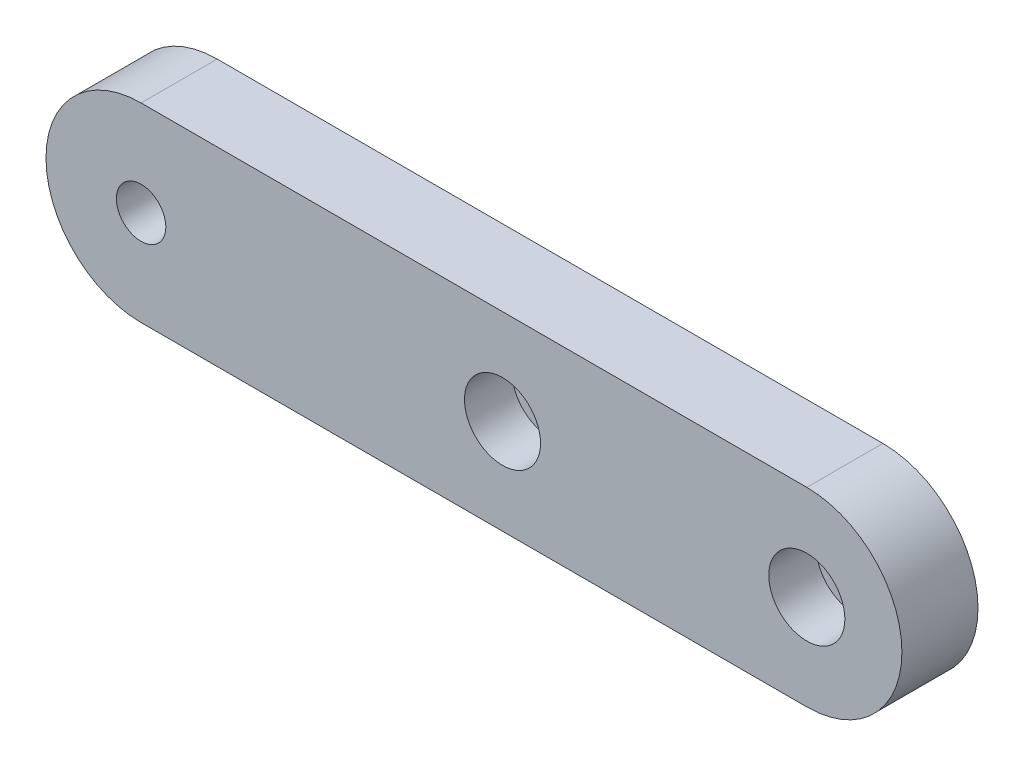
ISO-10303-21;
HEADER;
FILE_DESCRIPTION(('STEP AP214'),'2;1');
FILE_NAME('part.step','',(''),(''),'','','');
FILE_SCHEMA(('AUTOMOTIVE_DESIGN { 1 0 10303 214 1 1 1 1 }'));
ENDSEC;
DATA;
#1=APPLICATION_CONTEXT('core data for automotive mechanical design processes');
#2=APPLICATION_PROTOCOL_DEFINITION('international standard','automotive_design',2000,#1);
#3=PRODUCT_CONTEXT('',#1,'mechanical');
#4=PRODUCT('Part','Part','',(#3));
#5=PRODUCT_RELATED_PRODUCT_CATEGORY('part','',(#4));
#6=PRODUCT_DEFINITION_FORMATION('','',#4);
#7=PRODUCT_DEFINITION_CONTEXT('part definition',#1,'design');
#8=PRODUCT_DEFINITION('design','',#6,#7);
#9=PRODUCT_DEFINITION_SHAPE('','',#8);
#10=(LENGTH_UNIT() NAMED_UNIT(*) SI_UNIT(.MILLI.,.METRE.));
#11=(NAMED_UNIT(*) PLANE_ANGLE_UNIT() SI_UNIT($,.RADIAN.));
#12=(NAMED_UNIT(*) SI_UNIT($,.STERADIAN.) SOLID_ANGLE_UNIT());
#13=UNCERTAINTY_MEASURE_WITH_UNIT(LENGTH_MEASURE(1.E-05),#10,'distance_accuracy_value','');
#14=(GEOMETRIC_REPRESENTATION_CONTEXT(3) GLOBAL_UNCERTAINTY_ASSIGNED_CONTEXT((#13)) GLOBAL_UNIT_ASSIGNED_CONTEXT((#10,
#11,#12)) REPRESENTATION_CONTEXT('',''));
#15=CARTESIAN_POINT('',(0.,0.,0.));
#16=DIRECTION('',(0.,0.,1.));
#17=DIRECTION('',(1.,0.,0.));
#18=AXIS2_PLACEMENT_3D('',#15,#16,#17);
#19=CARTESIAN_POINT('',(1.50054000000001,0.,-0.00100000000000013));
#20=DIRECTION('',(0.,0.,1.));
#21=DIRECTION('',(1.,0.,0.));
#22=AXIS2_PLACEMENT_3D('',#19,#20,#21);
#23=CYLINDRICAL_SURFACE('',#22,1.19126);
#24=CARTESIAN_POINT('',(1.50054000000001,0.,0.));
#25=DIRECTION('',(0.,0.,1.));
#26=DIRECTION('',(1.,0.,0.));
#27=AXIS2_PLACEMENT_3D('',#24,#25,#26);
#28=CIRCLE('',#27,1.19126);
#29=CARTESIAN_POINT('',(2.69180000000001,0.,0.));
#30=VERTEX_POINT('',#29);
#31=EDGE_CURVE('E161',#30,#30,#28,.F.);
#32=ORIENTED_EDGE('',*,*,#31,.T.);
#33=EDGE_LOOP('',(#32));
#34=FACE_BOUND('',#33,.T.);
#35=CARTESIAN_POINT('',(1.50054000000001,0.,1.5));
#36=DIRECTION('',(0.,0.,1.));
#37=DIRECTION('',(1.,0.,0.));
#38=AXIS2_PLACEMENT_3D('',#35,#36,#37);
#39=CIRCLE('',#38,1.19126);
#40=CARTESIAN_POINT('',(2.69180000000001,0.,1.5));
#41=VERTEX_POINT('',#40);
#42=EDGE_CURVE('E47',#41,#41,#39,.F.);
#43=ORIENTED_EDGE('',*,*,#42,.F.);
#44=EDGE_LOOP('',(#43));
#45=FACE_BOUND('',#44,.T.);
#46=ADVANCED_FACE('F43',(#34,#45),#23,.F.);
#47=CARTESIAN_POINT('',(17.5,0.,-0.00100000000000013));
#48=DIRECTION('',(0.,0.,1.));
#49=DIRECTION('',(1.,0.,0.));
#50=AXIS2_PLACEMENT_3D('',#47,#48,#49);
#51=CYLINDRICAL_SURFACE('',#50,1.19126);
#52=CARTESIAN_POINT('',(17.5,0.,0.));
#53=DIRECTION('',(0.,0.,1.));
#54=DIRECTION('',(1.,0.,0.));
#55=AXIS2_PLACEMENT_3D('',#52,#53,#54);
#56=CIRCLE('',#55,1.19126);
#57=CARTESIAN_POINT('',(18.69126,0.,0.));
#58=VERTEX_POINT('',#57);
#59=EDGE_CURVE('E118',#58,#58,#56,.F.);
#60=ORIENTED_EDGE('',*,*,#59,.T.);
#61=EDGE_LOOP('',(#60));
#62=FACE_BOUND('',#61,.T.);
#63=CARTESIAN_POINT('',(17.5,0.,1.5));
#64=DIRECTION('',(0.,0.,1.));
#65=DIRECTION('',(1.,0.,0.));
#66=AXIS2_PLACEMENT_3D('',#63,#64,#65);
#67=CIRCLE('',#66,1.19126);
#68=CARTESIAN_POINT('',(18.69126,0.,1.5));
#69=VERTEX_POINT('',#68);
#70=EDGE_CURVE('E131',#69,#69,#67,.F.);
#71=ORIENTED_EDGE('',*,*,#70,.F.);
#72=EDGE_LOOP('',(#71));
#73=FACE_BOUND('',#72,.T.);
#74=ADVANCED_FACE('F192',(#62,#73),#51,.F.);
#75=CARTESIAN_POINT('',(0.,-5.,4.));
#76=DIRECTION('',(0.,1.,0.));
#77=DIRECTION('',(0.,0.,1.));
#78=AXIS2_PLACEMENT_3D('',#75,#76,#77);
#79=PLANE('',#78);
#80=DIRECTION('',(1.,0.,0.));
#81=VECTOR('',#80,1.);
#82=CARTESIAN_POINT('',(0.,-5.,0.));
#83=LINE('',#82,#81);
#84=CARTESIAN_POINT('',(-17.5,-5.,0.));
#85=VERTEX_POINT('',#84);
#86=CARTESIAN_POINT('',(17.5,-5.,0.));
#87=VERTEX_POINT('',#86);
#88=EDGE_CURVE('E115',#85,#87,#83,.T.);
#89=ORIENTED_EDGE('',*,*,#88,.T.);
#90=DIRECTION('',(0.,0.,-1.));
#91=VECTOR('',#90,1.);
#92=CARTESIAN_POINT('',(17.5,-5.,4.));
#93=LINE('',#92,#91);
#94=CARTESIAN_POINT('',(17.5,-5.,4.));
#95=VERTEX_POINT('',#94);
#96=EDGE_CURVE('E12',#95,#87,#93,.T.);
#97=ORIENTED_EDGE('',*,*,#96,.F.);
#98=DIRECTION('',(1.,0.,0.));
#99=VECTOR('',#98,1.);
#100=CARTESIAN_POINT('',(0.,-5.,4.));
#101=LINE('',#100,#99);
#102=CARTESIAN_POINT('',(-17.5,-5.,4.));
#103=VERTEX_POINT('',#102);
#104=EDGE_CURVE('E87',#103,#95,#101,.T.);
#105=ORIENTED_EDGE('',*,*,#104,.F.);
#106=DIRECTION('',(0.,0.,-1.));
#107=VECTOR('',#106,1.);
#108=CARTESIAN_POINT('',(-17.5,-5.,4.));
#109=LINE('',#108,#107);
#110=EDGE_CURVE('E63',#103,#85,#109,.T.);
#111=ORIENTED_EDGE('',*,*,#110,.T.);
#112=EDGE_LOOP('',(#89,#97,#105,#111));
#113=FACE_BOUND('',#112,.T.);
#114=ADVANCED_FACE('F45',(#113),#79,.F.);
#115=CARTESIAN_POINT('',(17.5,0.,4.));
#116=DIRECTION('',(0.,0.,-1.));
#117=DIRECTION('',(-1.,0.,0.));
#118=AXIS2_PLACEMENT_3D('',#115,#116,#117);
#119=CYLINDRICAL_SURFACE('',#118,5.);
#120=CARTESIAN_POINT('',(17.5,0.,0.));
#121=DIRECTION('',(0.,0.,1.));
#122=DIRECTION('',(1.,0.,0.));
#123=AXIS2_PLACEMENT_3D('',#120,#121,#122);
#124=CIRCLE('',#123,5.);
#125=CARTESIAN_POINT('',(17.5,5.,0.));
#126=VERTEX_POINT('',#125);
#127=EDGE_CURVE('E96',#126,#87,#124,.F.);
#128=ORIENTED_EDGE('',*,*,#127,.F.);
#129=DIRECTION('',(0.,0.,-1.));
#130=VECTOR('',#129,1.);
#131=CARTESIAN_POINT('',(17.5,5.,4.));
#132=LINE('',#131,#130);
#133=CARTESIAN_POINT('',(17.5,5.,4.));
#134=VERTEX_POINT('',#133);
#135=EDGE_CURVE('E54',#134,#126,#132,.T.);
#136=ORIENTED_EDGE('',*,*,#135,.F.);
#137=CARTESIAN_POINT('',(17.5,0.,4.));
#138=DIRECTION('',(0.,0.,1.));
#139=DIRECTION('',(1.,0.,0.));
#140=AXIS2_PLACEMENT_3D('',#137,#138,#139);
#141=CIRCLE('',#140,5.);
#142=EDGE_CURVE('E94',#134,#95,#141,.F.);
#143=ORIENTED_EDGE('',*,*,#142,.T.);
#144=ORIENTED_EDGE('',*,*,#96,.T.);
#145=EDGE_LOOP('',(#128,#136,#143,#144));
#146=FACE_BOUND('',#145,.T.);
#147=ADVANCED_FACE('F93',(#146),#119,.T.);
#148=CARTESIAN_POINT('',(0.,5.,4.));
#149=DIRECTION('',(0.,1.,0.));
#150=DIRECTION('',(0.,0.,1.));
#151=AXIS2_PLACEMENT_3D('',#148,#149,#150);
#152=PLANE('',#151);
#153=DIRECTION('',(1.,0.,0.));
#154=VECTOR('',#153,1.);
#155=CARTESIAN_POINT('',(0.,5.,0.));
#156=LINE('',#155,#154);
#157=CARTESIAN_POINT('',(-17.5,5.,0.));
#158=VERTEX_POINT('',#157);
#159=EDGE_CURVE('E121',#158,#126,#156,.T.);
#160=ORIENTED_EDGE('',*,*,#159,.F.);
#161=DIRECTION('',(0.,0.,-1.));
#162=VECTOR('',#161,1.);
#163=CARTESIAN_POINT('',(-17.5,5.,4.));
#164=LINE('',#163,#162);
#165=CARTESIAN_POINT('',(-17.5,5.,4.));
#166=VERTEX_POINT('',#165);
#167=EDGE_CURVE('E76',#166,#158,#164,.T.);
#168=ORIENTED_EDGE('',*,*,#167,.F.);
#169=DIRECTION('',(1.,0.,0.));
#170=VECTOR('',#169,1.);
#171=CARTESIAN_POINT('',(0.,5.,4.));
#172=LINE('',#171,#170);
#173=EDGE_CURVE('E104',#166,#134,#172,.T.);
#174=ORIENTED_EDGE('',*,*,#173,.T.);
#175=ORIENTED_EDGE('',*,*,#135,.T.);
#176=EDGE_LOOP('',(#160,#168,#174,#175));
#177=FACE_BOUND('',#176,.T.);
#178=ADVANCED_FACE('F107',(#177),#152,.T.);
#179=CARTESIAN_POINT('',(-17.5,0.,4.));
#180=DIRECTION('',(0.,0.,-1.));
#181=DIRECTION('',(-1.,0.,0.));
#182=AXIS2_PLACEMENT_3D('',#179,#180,#181);
#183=CYLINDRICAL_SURFACE('',#182,5.);
#184=CARTESIAN_POINT('',(-17.5,0.,0.));
#185=DIRECTION('',(0.,0.,1.));
#186=DIRECTION('',(1.,0.,0.));
#187=AXIS2_PLACEMENT_3D('',#184,#185,#186);
#188=CIRCLE('',#187,5.);
#189=EDGE_CURVE('E124',#85,#158,#188,.F.);
#190=ORIENTED_EDGE('',*,*,#189,.F.);
#191=ORIENTED_EDGE('',*,*,#110,.F.);
#192=CARTESIAN_POINT('',(-17.5,0.,4.));
#193=DIRECTION('',(0.,0.,1.));
#194=DIRECTION('',(1.,0.,0.));
#195=AXIS2_PLACEMENT_3D('',#192,#193,#194);
#196=CIRCLE('',#195,5.);
#197=EDGE_CURVE('E109',#103,#166,#196,.F.);
#198=ORIENTED_EDGE('',*,*,#197,.T.);
#199=ORIENTED_EDGE('',*,*,#167,.T.);
#200=EDGE_LOOP('',(#190,#191,#198,#199));
#201=FACE_BOUND('',#200,.T.);
#202=ADVANCED_FACE('F181',(#201),#183,.T.);
#203=CARTESIAN_POINT('',(0.,0.,4.));
#204=DIRECTION('',(0.,0.,1.));
#205=DIRECTION('',(1.,0.,0.));
#206=AXIS2_PLACEMENT_3D('',#203,#204,#205);
#207=PLANE('',#206);
#208=CARTESIAN_POINT('',(17.5,0.,4.));
#209=DIRECTION('',(0.,0.,1.));
#210=DIRECTION('',(1.,0.,0.));
#211=AXIS2_PLACEMENT_3D('',#208,#209,#210);
#212=CIRCLE('',#211,2.);
#213=CARTESIAN_POINT('',(19.5,0.,4.));
#214=VERTEX_POINT('',#213);
#215=EDGE_CURVE('E142',#214,#214,#212,.T.);
#216=ORIENTED_EDGE('',*,*,#215,.F.);
#217=EDGE_LOOP('',(#216));
#218=FACE_BOUND('',#217,.T.);
#219=CARTESIAN_POINT('',(1.50054000000001,0.,4.));
#220=DIRECTION('',(0.,0.,1.));
#221=DIRECTION('',(1.,0.,0.));
#222=AXIS2_PLACEMENT_3D('',#219,#220,#221);
#223=CIRCLE('',#222,2.);
#224=CARTESIAN_POINT('',(3.50054000000001,0.,4.));
#225=VERTEX_POINT('',#224);
#226=EDGE_CURVE('E151',#225,#225,#223,.T.);
#227=ORIENTED_EDGE('',*,*,#226,.F.);
#228=EDGE_LOOP('',(#227));
#229=FACE_BOUND('',#228,.T.);
#230=CARTESIAN_POINT('',(-17.5,0.,4.));
#231=DIRECTION('',(0.,0.,1.));
#232=DIRECTION('',(1.,0.,0.));
#233=AXIS2_PLACEMENT_3D('',#230,#231,#232);
#234=CIRCLE('',#233,1.3);
#235=CARTESIAN_POINT('',(-16.2,0.,4.));
#236=VERTEX_POINT('',#235);
#237=EDGE_CURVE('E140',#236,#236,#234,.T.);
#238=ORIENTED_EDGE('',*,*,#237,.F.);
#239=EDGE_LOOP('',(#238));
#240=FACE_BOUND('',#239,.T.);
#241=ORIENTED_EDGE('',*,*,#104,.T.);
#242=ORIENTED_EDGE('',*,*,#142,.F.);
#243=ORIENTED_EDGE('',*,*,#173,.F.);
#244=ORIENTED_EDGE('',*,*,#197,.F.);
#245=EDGE_LOOP('',(#241,#242,#243,#244));
#246=FACE_BOUND('',#245,.T.);
#247=ADVANCED_FACE('F103',(#218,#229,#240,#246),#207,.T.);
#248=CARTESIAN_POINT('',(0.,0.,0.));
#249=DIRECTION('',(0.,0.,1.));
#250=DIRECTION('',(1.,0.,0.));
#251=AXIS2_PLACEMENT_3D('',#248,#249,#250);
#252=PLANE('',#251);
#253=ORIENTED_EDGE('',*,*,#59,.F.);
#254=EDGE_LOOP('',(#253));
#255=FACE_BOUND('',#254,.T.);
#256=ORIENTED_EDGE('',*,*,#31,.F.);
#257=EDGE_LOOP('',(#256));
#258=FACE_BOUND('',#257,.T.);
#259=CARTESIAN_POINT('',(-17.5,0.,0.));
#260=DIRECTION('',(0.,0.,1.));
#261=DIRECTION('',(1.,0.,0.));
#262=AXIS2_PLACEMENT_3D('',#259,#260,#261);
#263=CIRCLE('',#262,1.3);
#264=CARTESIAN_POINT('',(-16.2,0.,0.));
#265=VERTEX_POINT('',#264);
#266=EDGE_CURVE('E165',#265,#265,#263,.F.);
#267=ORIENTED_EDGE('',*,*,#266,.F.);
#268=EDGE_LOOP('',(#267));
#269=FACE_BOUND('',#268,.T.);
#270=ORIENTED_EDGE('',*,*,#88,.F.);
#271=ORIENTED_EDGE('',*,*,#189,.T.);
#272=ORIENTED_EDGE('',*,*,#159,.T.);
#273=ORIENTED_EDGE('',*,*,#127,.T.);
#274=EDGE_LOOP('',(#270,#271,#272,#273));
#275=FACE_BOUND('',#274,.T.);
#276=ADVANCED_FACE('F176',(#255,#258,#269,#275),#252,.F.);
#277=CARTESIAN_POINT('',(-17.5,0.,-0.00100000000000013));
#278=DIRECTION('',(0.,0.,1.));
#279=DIRECTION('',(1.,0.,0.));
#280=AXIS2_PLACEMENT_3D('',#277,#278,#279);
#281=CYLINDRICAL_SURFACE('',#280,1.3);
#282=ORIENTED_EDGE('',*,*,#237,.T.);
#283=EDGE_LOOP('',(#282));
#284=FACE_BOUND('',#283,.T.);
#285=ORIENTED_EDGE('',*,*,#266,.T.);
#286=EDGE_LOOP('',(#285));
#287=FACE_BOUND('',#286,.T.);
#288=ADVANCED_FACE('F174',(#284,#287),#281,.F.);
#289=CARTESIAN_POINT('',(0.,0.,1.5));
#290=DIRECTION('',(0.,0.,1.));
#291=DIRECTION('',(1.,0.,0.));
#292=AXIS2_PLACEMENT_3D('',#289,#290,#291);
#293=PLANE('',#292);
#294=CARTESIAN_POINT('',(17.5,0.,1.5));
#295=DIRECTION('',(0.,0.,1.));
#296=DIRECTION('',(1.,0.,0.));
#297=AXIS2_PLACEMENT_3D('',#294,#295,#296);
#298=CIRCLE('',#297,2.);
#299=CARTESIAN_POINT('',(19.5,0.,1.5));
#300=VERTEX_POINT('',#299);
#301=EDGE_CURVE('E134',#300,#300,#298,.F.);
#302=ORIENTED_EDGE('',*,*,#301,.F.);
#303=EDGE_LOOP('',(#302));
#304=FACE_BOUND('',#303,.T.);
#305=ORIENTED_EDGE('',*,*,#70,.T.);
#306=EDGE_LOOP('',(#305));
#307=FACE_BOUND('',#306,.T.);
#308=ADVANCED_FACE('F204',(#304,#307),#293,.T.);
#309=CARTESIAN_POINT('',(17.5,0.,-5.65685424949239));
#310=DIRECTION('',(0.,0.,1.));
#311=DIRECTION('',(1.,0.,0.));
#312=AXIS2_PLACEMENT_3D('',#309,#310,#311);
#313=CYLINDRICAL_SURFACE('',#312,2.);
#314=ORIENTED_EDGE('',*,*,#301,.T.);
#315=EDGE_LOOP('',(#314));
#316=FACE_BOUND('',#315,.T.);
#317=ORIENTED_EDGE('',*,*,#215,.T.);
#318=EDGE_LOOP('',(#317));
#319=FACE_BOUND('',#318,.T.);
#320=ADVANCED_FACE('F209',(#316,#319),#313,.F.);
#321=CARTESIAN_POINT('',(0.,0.,1.5));
#322=DIRECTION('',(0.,0.,1.));
#323=DIRECTION('',(1.,0.,0.));
#324=AXIS2_PLACEMENT_3D('',#321,#322,#323);
#325=PLANE('',#324);
#326=CARTESIAN_POINT('',(1.50054000000001,0.,1.5));
#327=DIRECTION('',(0.,0.,1.));
#328=DIRECTION('',(1.,0.,0.));
#329=AXIS2_PLACEMENT_3D('',#326,#327,#328);
#330=CIRCLE('',#329,2.);
#331=CARTESIAN_POINT('',(3.50054000000001,0.,1.5));
#332=VERTEX_POINT('',#331);
#333=EDGE_CURVE('E148',#332,#332,#330,.F.);
#334=ORIENTED_EDGE('',*,*,#333,.F.);
#335=EDGE_LOOP('',(#334));
#336=FACE_BOUND('',#335,.T.);
#337=ORIENTED_EDGE('',*,*,#42,.T.);
#338=EDGE_LOOP('',(#337));
#339=FACE_BOUND('',#338,.T.);
#340=ADVANCED_FACE('F217',(#336,#339),#325,.T.);
#341=CARTESIAN_POINT('',(1.50054000000001,0.,-5.65685424949239));
#342=DIRECTION('',(0.,0.,1.));
#343=DIRECTION('',(1.,0.,0.));
#344=AXIS2_PLACEMENT_3D('',#341,#342,#343);
#345=CYLINDRICAL_SURFACE('',#344,2.);
#346=ORIENTED_EDGE('',*,*,#333,.T.);
#347=EDGE_LOOP('',(#346));
#348=FACE_BOUND('',#347,.T.);
#349=ORIENTED_EDGE('',*,*,#226,.T.);
#350=EDGE_LOOP('',(#349));
#351=FACE_BOUND('',#350,.T.);
#352=ADVANCED_FACE('F221',(#348,#351),#345,.F.);
#353=CLOSED_SHELL('',(#46,#74,#114,#147,#178,#202,#247,#276,#288,#308,#320,#340,#352));
#354=MANIFOLD_SOLID_BREP('B2',#353);
#355=ADVANCED_BREP_SHAPE_REPRESENTATION('',(#18,#354),#14);
#356=SHAPE_DEFINITION_REPRESENTATION(#9,#355);
ENDSEC;
END-ISO-10303-21;
